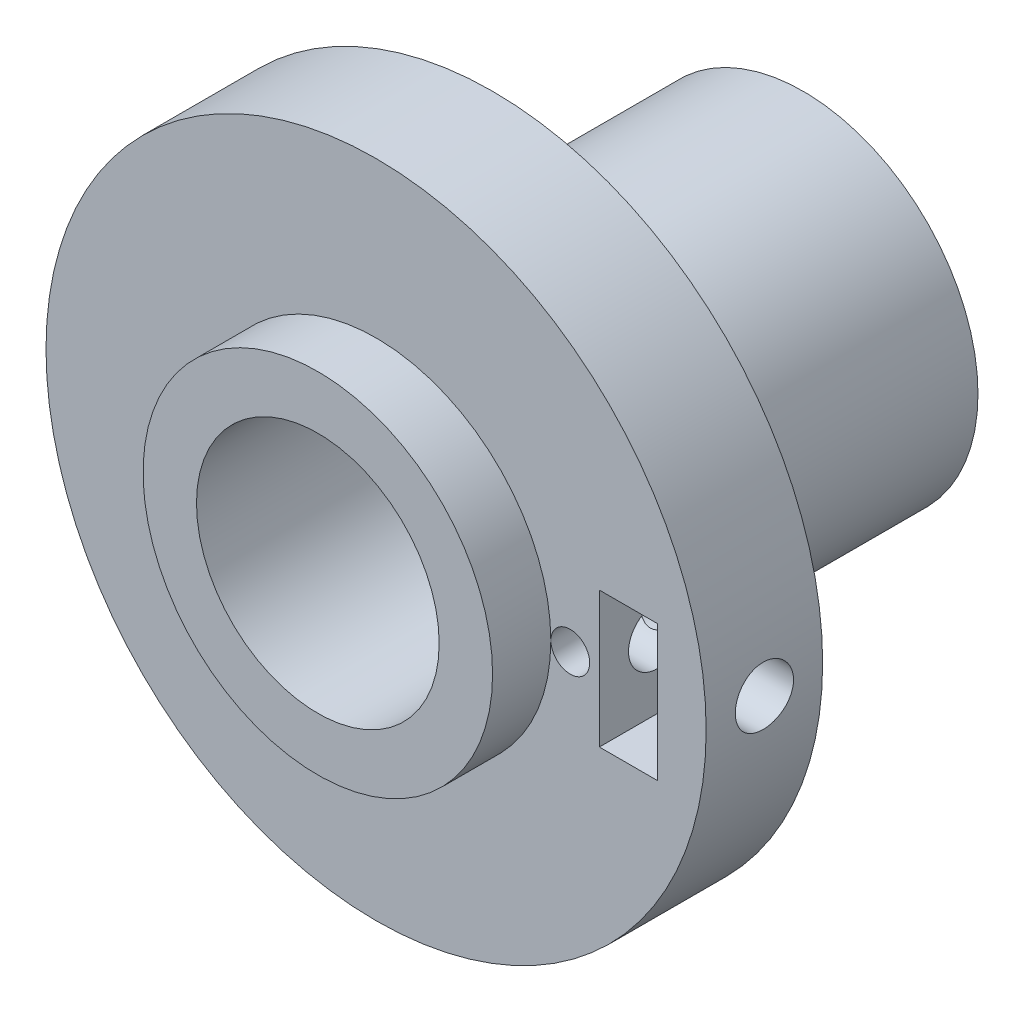
ISO-10303-21;
HEADER;
FILE_DESCRIPTION(('STEP AP214'),'2;1');
FILE_NAME('part.step','',(''),(''),'','','');
FILE_SCHEMA(('AUTOMOTIVE_DESIGN { 1 0 10303 214 1 1 1 1 }'));
ENDSEC;
DATA;
#1=APPLICATION_CONTEXT('core data for automotive mechanical design processes');
#2=APPLICATION_PROTOCOL_DEFINITION('international standard','automotive_design',2000,#1);
#3=PRODUCT_CONTEXT('',#1,'mechanical');
#4=PRODUCT('Part','Part','',(#3));
#5=PRODUCT_RELATED_PRODUCT_CATEGORY('part','',(#4));
#6=PRODUCT_DEFINITION_FORMATION('','',#4);
#7=PRODUCT_DEFINITION_CONTEXT('part definition',#1,'design');
#8=PRODUCT_DEFINITION('design','',#6,#7);
#9=PRODUCT_DEFINITION_SHAPE('','',#8);
#10=(LENGTH_UNIT() NAMED_UNIT(*) SI_UNIT(.MILLI.,.METRE.));
#11=(NAMED_UNIT(*) PLANE_ANGLE_UNIT() SI_UNIT($,.RADIAN.));
#12=(NAMED_UNIT(*) SI_UNIT($,.STERADIAN.) SOLID_ANGLE_UNIT());
#13=UNCERTAINTY_MEASURE_WITH_UNIT(LENGTH_MEASURE(1.E-05),#10,'distance_accuracy_value','');
#14=(GEOMETRIC_REPRESENTATION_CONTEXT(3) GLOBAL_UNCERTAINTY_ASSIGNED_CONTEXT((#13)) GLOBAL_UNIT_ASSIGNED_CONTEXT((#10,
#11,#12)) REPRESENTATION_CONTEXT('',''));
#15=CARTESIAN_POINT('',(0.,0.,0.));
#16=DIRECTION('',(0.,0.,1.));
#17=DIRECTION('',(1.,0.,0.));
#18=AXIS2_PLACEMENT_3D('',#15,#16,#17);
#19=CARTESIAN_POINT('',(9.,0.,11.));
#20=DIRECTION('',(1.,0.,0.));
#21=DIRECTION('',(0.,0.,-1.));
#22=AXIS2_PLACEMENT_3D('',#19,#20,#21);
#23=CYLINDRICAL_SURFACE('',#22,1.5);
#24=CARTESIAN_POINT('',(11.5,0.,11.));
#25=DIRECTION('',(-1.,0.,0.));
#26=DIRECTION('',(0.,-1.,0.));
#27=AXIS2_PLACEMENT_3D('',#24,#25,#26);
#28=CIRCLE('',#27,1.5);
#29=CARTESIAN_POINT('',(11.5,-1.5,11.));
#30=VERTEX_POINT('',#29);
#31=EDGE_CURVE('E37',#30,#30,#28,.F.);
#32=ORIENTED_EDGE('',*,*,#31,.T.);
#33=EDGE_LOOP('',(#32));
#34=FACE_BOUND('',#33,.T.);
#35=CARTESIAN_POINT('',(9.,0.,11.));
#36=DIRECTION('',(1.,0.,0.));
#37=DIRECTION('',(0.,0.,-1.));
#38=AXIS2_PLACEMENT_3D('',#35,#36,#37);
#39=CIRCLE('',#38,1.5);
#40=CARTESIAN_POINT('',(9.,0.,12.5));
#41=VERTEX_POINT('',#40);
#42=CARTESIAN_POINT('',(9.,0.,9.49999999999999));
#43=VERTEX_POINT('',#42);
#44=EDGE_CURVE('E132',#41,#43,#39,.T.);
#45=ORIENTED_EDGE('',*,*,#44,.F.);
#46=CARTESIAN_POINT('',(9.,0.,12.5));
#47=CARTESIAN_POINT('',(8.99999972518375,0.050242358334064,12.5000002082241));
#48=CARTESIAN_POINT('',(9.00380698497774,0.100484543566457,12.4974540137669));
#49=CARTESIAN_POINT('',(9.01879843205283,0.199366529015834,12.4875232621191));
#50=CARTESIAN_POINT('',(9.02998612156165,0.248005556977502,12.4801364079062));
#51=CARTESIAN_POINT('',(9.05905385866242,0.342106153927126,12.4612524120235));
#52=CARTESIAN_POINT('',(9.07690257000397,0.387581436328778,12.4497745274666));
#53=CARTESIAN_POINT('',(9.11853168163575,0.474707645498629,12.4236306893872));
#54=CARTESIAN_POINT('',(9.14231294315028,0.516358015804834,12.4089642730275));
#55=CARTESIAN_POINT('',(9.19732846868371,0.598642350385055,12.3761366468492));
#56=CARTESIAN_POINT('',(9.22902393037144,0.638890152730338,12.3577844878966));
#57=CARTESIAN_POINT('',(9.29786502432922,0.71386402234637,12.3199115654173));
#58=CARTESIAN_POINT('',(9.33501846491887,0.74858202771944,12.3003891517841));
#59=CARTESIAN_POINT('',(9.42052618380633,0.817111488727481,12.258641323394));
#60=CARTESIAN_POINT('',(9.46972282660172,0.849915931813757,12.236475339689));
#61=CARTESIAN_POINT('',(9.57418168882327,0.90675178507087,12.1954207367641));
#62=CARTESIAN_POINT('',(9.62943320078139,0.930798367132496,12.1765264797733));
#63=CARTESIAN_POINT('',(9.7283556467108,0.963370175057205,12.1498813332073));
#64=CARTESIAN_POINT('',(9.77076422643691,0.974372236180084,12.1404881394622));
#65=CARTESIAN_POINT('',(9.85737225237087,0.990753088926102,12.1262898482978));
#66=CARTESIAN_POINT('',(9.90156847436319,0.996141573259662,12.1214768437201));
#67=CARTESIAN_POINT('',(9.99073738942808,1.00095682070629,12.1171830280408));
#68=CARTESIAN_POINT('',(10.0357125117256,1.0003592145882,12.1177240127948));
#69=CARTESIAN_POINT('',(10.1248174867505,0.993187906666196,12.1240988774148));
#70=CARTESIAN_POINT('',(10.1689465910163,0.986609141899785,12.1299372414259));
#71=CARTESIAN_POINT('',(10.2532335256188,0.968324971088713,12.1456359299579));
#72=CARTESIAN_POINT('',(10.2934806679615,0.956858557405004,12.1553074416515));
#73=CARTESIAN_POINT('',(10.3715118454958,0.929350592909502,12.1775481146384));
#74=CARTESIAN_POINT('',(10.4092950651486,0.913307536614355,12.1901182291639));
#75=CARTESIAN_POINT('',(10.4895126976411,0.873369093698318,12.2198209820221));
#76=CARTESIAN_POINT('',(10.5313299500941,0.848540261643841,12.2373615892451));
#77=CARTESIAN_POINT('',(10.6106916974919,0.793344802336528,12.2734576892248));
#78=CARTESIAN_POINT('',(10.6482308288371,0.762971345040336,12.2920144137095));
#79=CARTESIAN_POINT('',(10.7262712728556,0.689905826559708,12.3327167186209));
#80=CARTESIAN_POINT('',(10.7656670243557,0.645969691404496,12.3547737235502));
#81=CARTESIAN_POINT('',(10.8365982472549,0.551003999553807,12.3960905033786));
#82=CARTESIAN_POINT('',(10.8681410727011,0.49998114967516,12.4153528882528));
#83=CARTESIAN_POINT('',(10.9167388593142,0.402428913545598,12.4457270204417));
#84=CARTESIAN_POINT('',(10.9354216816702,0.356978821685239,12.457696305825));
#85=CARTESIAN_POINT('',(10.9660524628119,0.263018021968452,12.4775385951552));
#86=CARTESIAN_POINT('',(10.9780061135659,0.214509939501015,12.4854150606384));
#87=CARTESIAN_POINT('',(10.9945805826192,0.115492726585944,12.4963794107833));
#88=CARTESIAN_POINT('',(10.9991697304692,0.0649759059670204,12.4994466123057));
#89=CARTESIAN_POINT('',(11.0006235442811,-0.03622075969462,12.5004155748259));
#90=CARTESIAN_POINT('',(10.9974887502444,-0.0869005930932851,12.4983176969281));
#91=CARTESIAN_POINT('',(10.984187972219,-0.18322785860215,12.4894979471214));
#92=CARTESIAN_POINT('',(10.9745313511223,-0.228978722339659,12.4831112319513));
#93=CARTESIAN_POINT('',(10.9492021569936,-0.318058196213643,12.466592246424));
#94=CARTESIAN_POINT('',(10.9335286245361,-0.361386418785358,12.4564593787341));
#95=CARTESIAN_POINT('',(10.8956738514773,-0.447332375233225,12.4324817626467));
#96=CARTESIAN_POINT('',(10.8731559229582,-0.489748092316567,12.4184493506824));
#97=CARTESIAN_POINT('',(10.8227833550277,-0.570341511977794,12.388009278054));
#98=CARTESIAN_POINT('',(10.794925419737,-0.608516574097259,12.3716001520065));
#99=CARTESIAN_POINT('',(10.7296960659176,-0.685927227415327,12.3347727332824));
#100=CARTESIAN_POINT('',(10.691516869948,-0.724375937862668,12.314130784062));
#101=CARTESIAN_POINT('',(10.6094442850359,-0.794669840332396,12.2728558653685));
#102=CARTESIAN_POINT('',(10.5655469805006,-0.826510468230437,12.2522229118595));
#103=CARTESIAN_POINT('',(10.4764287935708,-0.880623882794766,12.2146983950652));
#104=CARTESIAN_POINT('',(10.4316339831001,-0.903478180804396,12.1976379858866));
#105=CARTESIAN_POINT('',(10.3380636736094,-0.942481068876254,12.1671948720711));
#106=CARTESIAN_POINT('',(10.2892955308023,-0.958641728453861,12.1538055628277));
#107=CARTESIAN_POINT('',(10.197717756433,-0.981179217293121,12.1346660407653));
#108=CARTESIAN_POINT('',(10.1554140950705,-0.988792987823093,12.1279749900689));
#109=CARTESIAN_POINT('',(10.0697133593323,-0.998496029624889,12.1193973322293));
#110=CARTESIAN_POINT('',(10.0263175244268,-1.00059130142516,12.1175055067407));
#111=CARTESIAN_POINT('',(9.93967847164164,-0.999119609907758,12.1188210057483));
#112=CARTESIAN_POINT('',(9.89643535931854,-0.995549293852658,12.1220313495683));
#113=CARTESIAN_POINT('',(9.81132823572852,-0.982984986109972,12.1330522619864));
#114=CARTESIAN_POINT('',(9.76946614306961,-0.973983758587652,12.1408689675122));
#115=CARTESIAN_POINT('',(9.67714440678569,-0.94796517835631,12.1626342196827));
#116=CARTESIAN_POINT('',(9.62736614363047,-0.929450935941996,12.177661668546));
#117=CARTESIAN_POINT('',(9.53225658291059,-0.885422631474876,12.2111108062916));
#118=CARTESIAN_POINT('',(9.48693165103157,-0.859898741785423,12.2295372486188));
#119=CARTESIAN_POINT('',(9.40035905640316,-0.80199140269466,12.2680859326972));
#120=CARTESIAN_POINT('',(9.35920062728075,-0.769491549448274,12.2882329369107));
#121=CARTESIAN_POINT('',(9.28233876087877,-0.698358840177312,12.3281415077399));
#122=CARTESIAN_POINT('',(9.2466370014876,-0.659724105134954,12.3479029541764));
#123=CARTESIAN_POINT('',(9.17664394784294,-0.570728664877771,12.3881577598039));
#124=CARTESIAN_POINT('',(9.14329067991017,-0.519480834775989,12.4083490272456));
#125=CARTESIAN_POINT('',(9.08604336166801,-0.410434277887491,12.4438883293752));
#126=CARTESIAN_POINT('',(9.06213444658818,-0.352646031225024,12.4592439672273));
#127=CARTESIAN_POINT('',(9.02942271091798,-0.245717534917526,12.4805082241837));
#128=CARTESIAN_POINT('',(9.01844448045066,-0.197506162628868,12.4877574018445));
#129=CARTESIAN_POINT('',(9.00373598373098,-0.0995290060120657,12.4975014007095));
#130=CARTESIAN_POINT('',(9.000000272202,-0.0497644180940288,12.4999997937566));
#131=CARTESIAN_POINT('',(9.,0.,12.5));
#132=B_SPLINE_CURVE_WITH_KNOTS('',3,(#46,#47,#48,#49,#50,#51,#52,#53,#54,#55,#56,#57,#58,#59,
#60,#61,#62,#63,#64,#65,#66,#67,#68,#69,#70,#71,#72,#73,#74,#75,#76,#77,#78,#79,#80,#81,#82,#83,
#84,#85,#86,#87,#88,#89,#90,#91,#92,#93,#94,#95,#96,#97,#98,#99,#100,#101,#102,#103,#104,#105,
#106,#107,#108,#109,#110,#111,#112,#113,#114,#115,#116,#117,#118,#119,#120,#121,#122,#123,#124,
#125,#126,#127,#128,#129,#130,#131),.UNSPECIFIED.,.T.,.F.,(4,2,2,2,2,2,2,2,2,2,2,2,2,2,2,2,2,2,
2,2,2,2,2,2,2,2,2,2,2,2,2,2,2,2,2,2,2,2,2,2,2,2,4),(0.,0.1505266132527,0.301124707174344,
0.451023076595116,0.600943219336933,0.763585145002784,0.926462058021593,1.11503341647992,
1.3032765272272,1.43716846838015,1.57082883922905,1.7050335586769,1.83935198631677,
1.96774431099011,2.0961789190254,2.25073787329798,2.40548851889213,2.59359477247561,
2.78152420149866,2.93262043847564,3.08358867570591,3.2352044164631,3.38680955765892,
3.52776542395421,3.6687437756832,3.81826173413943,3.96787227471787,4.14114088069831,
4.31452876587064,4.47324967649701,4.63168313315307,4.76162024003012,4.89141600161491,
5.02128860137218,5.15133461921145,5.31603304346011,5.48096356682587,5.64889622595853,
5.81688041978686,6.00897675773025,6.20076953274024,6.34997645676983,6.49907115623395),.UNSPECIFIED.);
#133=EDGE_CURVE('E42',#41,#41,#132,.T.);
#134=ORIENTED_EDGE('',*,*,#133,.F.);
#135=EDGE_CURVE('E135',#43,#41,#39,.T.);
#136=ORIENTED_EDGE('',*,*,#135,.F.);
#137=CARTESIAN_POINT('',(9.,0.,9.49999999999999));
#138=CARTESIAN_POINT('',(8.99999972518375,-0.050242358334064,9.49999979177585));
#139=CARTESIAN_POINT('',(9.00380698497774,-0.100484543566457,9.50254598623307));
#140=CARTESIAN_POINT('',(9.01879843205283,-0.199366529015834,9.51247673788094));
#141=CARTESIAN_POINT('',(9.02998612156165,-0.248005556977502,9.51986359209382));
#142=CARTESIAN_POINT('',(9.05905385866242,-0.342106153927126,9.53874758797646));
#143=CARTESIAN_POINT('',(9.07690257000397,-0.387581436328778,9.55022547253342));
#144=CARTESIAN_POINT('',(9.11853168163575,-0.474707645498629,9.57636931061279));
#145=CARTESIAN_POINT('',(9.14231294315028,-0.516358015804834,9.59103572697245));
#146=CARTESIAN_POINT('',(9.19732846868371,-0.598642350385055,9.6238633531508));
#147=CARTESIAN_POINT('',(9.22902393037144,-0.638890152730338,9.6422155121034));
#148=CARTESIAN_POINT('',(9.29786502432922,-0.71386402234637,9.68008843458267));
#149=CARTESIAN_POINT('',(9.33501846491887,-0.74858202771944,9.69961084821584));
#150=CARTESIAN_POINT('',(9.42052618380633,-0.817111488727481,9.74135867660602));
#151=CARTESIAN_POINT('',(9.46972282660172,-0.849915931813757,9.763524660311));
#152=CARTESIAN_POINT('',(9.57418168882327,-0.90675178507087,9.80457926323592));
#153=CARTESIAN_POINT('',(9.62943320078139,-0.930798367132496,9.82347352022673));
#154=CARTESIAN_POINT('',(9.7283556467108,-0.963370175057205,9.85011866679264));
#155=CARTESIAN_POINT('',(9.77076422643691,-0.974372236180084,9.85951186053782));
#156=CARTESIAN_POINT('',(9.85737225237087,-0.990753088926102,9.87371015170214));
#157=CARTESIAN_POINT('',(9.90156847436319,-0.996141573259662,9.87852315627987));
#158=CARTESIAN_POINT('',(9.99073738942808,-1.00095682070629,9.88281697195916));
#159=CARTESIAN_POINT('',(10.0357125117256,-1.0003592145882,9.88227598720522));
#160=CARTESIAN_POINT('',(10.1248174867505,-0.993187906666196,9.87590112258514));
#161=CARTESIAN_POINT('',(10.1689465910163,-0.986609141899785,9.87006275857408));
#162=CARTESIAN_POINT('',(10.2532335256188,-0.968324971088713,9.85436407004209));
#163=CARTESIAN_POINT('',(10.2934806679615,-0.956858557405004,9.84469255834846));
#164=CARTESIAN_POINT('',(10.3715118454958,-0.929350592909502,9.82245188536155));
#165=CARTESIAN_POINT('',(10.4092950651486,-0.913307536614355,9.80988177083612));
#166=CARTESIAN_POINT('',(10.4895126976411,-0.873369093698318,9.78017901797788));
#167=CARTESIAN_POINT('',(10.5313299500941,-0.848540261643841,9.76263841075493));
#168=CARTESIAN_POINT('',(10.6106916974919,-0.793344802336527,9.72654231077516));
#169=CARTESIAN_POINT('',(10.6482308288371,-0.762971345040336,9.70798558629053));
#170=CARTESIAN_POINT('',(10.7262712728556,-0.689905826559708,9.66728328137904));
#171=CARTESIAN_POINT('',(10.7656670243557,-0.645969691404496,9.64522627644975));
#172=CARTESIAN_POINT('',(10.8365982472549,-0.551003999553807,9.60390949662143));
#173=CARTESIAN_POINT('',(10.8681410727011,-0.49998114967516,9.58464711174715));
#174=CARTESIAN_POINT('',(10.9167388593142,-0.402428913545598,9.55427297955834));
#175=CARTESIAN_POINT('',(10.9354216816702,-0.356978821685239,9.54230369417502));
#176=CARTESIAN_POINT('',(10.9660524628119,-0.263018021968452,9.52246140484478));
#177=CARTESIAN_POINT('',(10.9780061135659,-0.214509939501015,9.51458493936155));
#178=CARTESIAN_POINT('',(10.9945805826192,-0.115492726585944,9.50362058921668));
#179=CARTESIAN_POINT('',(10.9991697304692,-0.0649759059670204,9.50055338769424));
#180=CARTESIAN_POINT('',(11.0006235442811,0.0362207596946201,9.49958442517408));
#181=CARTESIAN_POINT('',(10.9974887502444,0.0869005930932851,9.50168230307184));
#182=CARTESIAN_POINT('',(10.984187972219,0.18322785860215,9.51050205287862));
#183=CARTESIAN_POINT('',(10.9745313511223,0.228978722339659,9.51688876804865));
#184=CARTESIAN_POINT('',(10.9492021569936,0.318058196213643,9.53340775357603));
#185=CARTESIAN_POINT('',(10.9335286245361,0.361386418785358,9.54354062126592));
#186=CARTESIAN_POINT('',(10.8956738514773,0.447332375233225,9.56751823735329));
#187=CARTESIAN_POINT('',(10.8731559229582,0.489748092316567,9.58155064931755));
#188=CARTESIAN_POINT('',(10.8227833550277,0.570341511977794,9.61199072194597));
#189=CARTESIAN_POINT('',(10.794925419737,0.608516574097259,9.62839984799348));
#190=CARTESIAN_POINT('',(10.7296960659176,0.685927227415327,9.66522726671757));
#191=CARTESIAN_POINT('',(10.691516869948,0.724375937862668,9.68586921593797));
#192=CARTESIAN_POINT('',(10.6094442850359,0.794669840332396,9.72714413463145));
#193=CARTESIAN_POINT('',(10.5655469805006,0.826510468230437,9.74777708814054));
#194=CARTESIAN_POINT('',(10.4764287935708,0.880623882794766,9.78530160493483));
#195=CARTESIAN_POINT('',(10.4316339831001,0.903478180804396,9.80236201411338));
#196=CARTESIAN_POINT('',(10.3380636736094,0.942481068876254,9.83280512792887));
#197=CARTESIAN_POINT('',(10.2892955308023,0.958641728453861,9.8461944371723));
#198=CARTESIAN_POINT('',(10.197717756433,0.981179217293121,9.86533395923468));
#199=CARTESIAN_POINT('',(10.1554140950705,0.988792987823093,9.87202500993105));
#200=CARTESIAN_POINT('',(10.0697133593323,0.998496029624889,9.88060266777071));
#201=CARTESIAN_POINT('',(10.0263175244268,1.00059130142516,9.88249449325934));
#202=CARTESIAN_POINT('',(9.93967847164164,0.999119609907758,9.88117899425167));
#203=CARTESIAN_POINT('',(9.89643535931854,0.995549293852658,9.87796865043166));
#204=CARTESIAN_POINT('',(9.81132823572852,0.982984986109972,9.8669477380136));
#205=CARTESIAN_POINT('',(9.76946614306961,0.973983758587652,9.85913103248783));
#206=CARTESIAN_POINT('',(9.67714440678569,0.94796517835631,9.8373657803173));
#207=CARTESIAN_POINT('',(9.62736614363047,0.929450935941996,9.82233833145398));
#208=CARTESIAN_POINT('',(9.53225658291059,0.885422631474876,9.78888919370839));
#209=CARTESIAN_POINT('',(9.48693165103157,0.859898741785423,9.77046275138117));
#210=CARTESIAN_POINT('',(9.40035905640316,0.80199140269466,9.73191406730274));
#211=CARTESIAN_POINT('',(9.35920062728075,0.769491549448274,9.71176706308929));
#212=CARTESIAN_POINT('',(9.28233876087877,0.698358840177312,9.67185849226007));
#213=CARTESIAN_POINT('',(9.2466370014876,0.659724105134954,9.6520970458236));
#214=CARTESIAN_POINT('',(9.17664394784294,0.570728664877771,9.61184224019608));
#215=CARTESIAN_POINT('',(9.14329067991017,0.519480834775989,9.59165097275442));
#216=CARTESIAN_POINT('',(9.08604336166801,0.410434277887491,9.55611167062482));
#217=CARTESIAN_POINT('',(9.06213444658818,0.352646031225024,9.54075603277269));
#218=CARTESIAN_POINT('',(9.02942271091798,0.245717534917526,9.51949177581632));
#219=CARTESIAN_POINT('',(9.01844448045066,0.197506162628868,9.51224259815554));
#220=CARTESIAN_POINT('',(9.00373598373098,0.0995290060120657,9.50249859929052));
#221=CARTESIAN_POINT('',(9.000000272202,0.0497644180940288,9.50000020624336));
#222=CARTESIAN_POINT('',(9.,0.,9.49999999999999));
#223=B_SPLINE_CURVE_WITH_KNOTS('',3,(#137,#138,#139,#140,#141,#142,#143,#144,#145,#146,#147,
#148,#149,#150,#151,#152,#153,#154,#155,#156,#157,#158,#159,#160,#161,#162,#163,#164,#165,#166,
#167,#168,#169,#170,#171,#172,#173,#174,#175,#176,#177,#178,#179,#180,#181,#182,#183,#184,#185,
#186,#187,#188,#189,#190,#191,#192,#193,#194,#195,#196,#197,#198,#199,#200,#201,#202,#203,#204,
#205,#206,#207,#208,#209,#210,#211,#212,#213,#214,#215,#216,#217,#218,#219,#220,#221,#222),
.UNSPECIFIED.,.T.,.F.,(4,2,2,2,2,2,2,2,2,2,2,2,2,2,2,2,2,2,2,2,2,2,2,2,2,2,2,2,2,2,2,2,2,2,2,2,
2,2,2,2,2,2,4),(0.,0.1505266132527,0.301124707174344,0.451023076595116,0.600943219336933,
0.763585145002784,0.926462058021593,1.11503341647992,1.3032765272272,1.43716846838015,
1.57082883922905,1.7050335586769,1.83935198631677,1.96774431099011,2.0961789190254,
2.25073787329798,2.40548851889213,2.59359477247561,2.78152420149866,2.93262043847564,
3.08358867570591,3.2352044164631,3.38680955765892,3.52776542395421,3.6687437756832,
3.81826173413943,3.96787227471787,4.14114088069831,4.31452876587064,4.47324967649701,
4.63168313315307,4.76162024003012,4.89141600161491,5.02128860137218,5.15133461921145,
5.31603304346011,5.48096356682587,5.64889622595853,5.81688041978686,6.00897675773025,
6.20076953274024,6.34997645676983,6.49907115623395),.UNSPECIFIED.);
#224=EDGE_CURVE('E11',#43,#43,#223,.T.);
#225=ORIENTED_EDGE('',*,*,#224,.F.);
#226=EDGE_LOOP('',(#45,#134,#136,#225));
#227=FACE_BOUND('',#226,.T.);
#228=ADVANCED_FACE('F33',(#34,#227),#23,.F.);
#229=CARTESIAN_POINT('',(10.,0.,14.));
#230=DIRECTION('',(0.,0.,-1.));
#231=DIRECTION('',(-1.,0.,0.));
#232=AXIS2_PLACEMENT_3D('',#229,#230,#231);
#233=CYLINDRICAL_SURFACE('',#232,1.);
#234=ORIENTED_EDGE('',*,*,#224,.T.);
#235=EDGE_LOOP('',(#234));
#236=FACE_BOUND('',#235,.T.);
#237=CARTESIAN_POINT('',(10.,0.,8.));
#238=DIRECTION('',(0.,0.,-1.));
#239=DIRECTION('',(-1.,0.,0.));
#240=AXIS2_PLACEMENT_3D('',#237,#238,#239);
#241=CIRCLE('',#240,1.);
#242=CARTESIAN_POINT('',(9.,0.,8.));
#243=VERTEX_POINT('',#242);
#244=EDGE_CURVE('E145',#243,#243,#241,.T.);
#245=ORIENTED_EDGE('',*,*,#244,.T.);
#246=EDGE_LOOP('',(#245));
#247=FACE_BOUND('',#246,.T.);
#248=ADVANCED_FACE('F190',(#236,#247),#233,.F.);
#249=CARTESIAN_POINT('',(0.,0.,-8.));
#250=DIRECTION('',(0.,0.,1.));
#251=DIRECTION('',(1.,0.,0.));
#252=AXIS2_PLACEMENT_3D('',#249,#250,#251);
#253=PLANE('',#252);
#254=CARTESIAN_POINT('',(0.,0.,-8.));
#255=DIRECTION('',(0.,0.,1.));
#256=DIRECTION('',(1.,0.,0.));
#257=AXIS2_PLACEMENT_3D('',#254,#255,#256);
#258=CIRCLE('',#257,9.);
#259=CARTESIAN_POINT('',(9.,0.,-8.));
#260=VERTEX_POINT('',#259);
#261=EDGE_CURVE('E331',#260,#260,#258,.T.);
#262=ORIENTED_EDGE('',*,*,#261,.F.);
#263=EDGE_LOOP('',(#262));
#264=FACE_BOUND('',#263,.T.);
#265=CARTESIAN_POINT('',(0.,0.,-8.));
#266=DIRECTION('',(0.,0.,1.));
#267=DIRECTION('',(1.,0.,0.));
#268=AXIS2_PLACEMENT_3D('',#265,#266,#267);
#269=CIRCLE('',#268,6.25);
#270=CARTESIAN_POINT('',(6.25,0.,-8.));
#271=VERTEX_POINT('',#270);
#272=EDGE_CURVE('E334',#271,#271,#269,.T.);
#273=ORIENTED_EDGE('',*,*,#272,.T.);
#274=EDGE_LOOP('',(#273));
#275=FACE_BOUND('',#274,.T.);
#276=ADVANCED_FACE('F195',(#264,#275),#253,.F.);
#277=CARTESIAN_POINT('',(0.,0.,8.));
#278=DIRECTION('',(0.,0.,-1.));
#279=DIRECTION('',(-1.,0.,0.));
#280=AXIS2_PLACEMENT_3D('',#277,#278,#279);
#281=CYLINDRICAL_SURFACE('',#280,9.);
#282=CARTESIAN_POINT('',(0.,0.,8.));
#283=DIRECTION('',(0.,0.,1.));
#284=DIRECTION('',(1.,0.,0.));
#285=AXIS2_PLACEMENT_3D('',#282,#283,#284);
#286=CIRCLE('',#285,9.);
#287=EDGE_CURVE('E337',#243,#243,#286,.T.);
#288=ORIENTED_EDGE('',*,*,#287,.F.);
#289=EDGE_LOOP('',(#288));
#290=FACE_BOUND('',#289,.T.);
#291=ORIENTED_EDGE('',*,*,#261,.T.);
#292=EDGE_LOOP('',(#291));
#293=FACE_BOUND('',#292,.T.);
#294=ADVANCED_FACE('F35',(#290,#293),#281,.T.);
#295=CARTESIAN_POINT('',(0.,0.,8.));
#296=DIRECTION('',(0.,0.,-1.));
#297=DIRECTION('',(-1.,0.,0.));
#298=AXIS2_PLACEMENT_3D('',#295,#296,#297);
#299=CYLINDRICAL_SURFACE('',#298,6.25);
#300=ORIENTED_EDGE('',*,*,#272,.F.);
#301=EDGE_LOOP('',(#300));
#302=FACE_BOUND('',#301,.T.);
#303=CARTESIAN_POINT('',(0.,0.,17.));
#304=DIRECTION('',(0.,0.,1.));
#305=DIRECTION('',(1.,0.,0.));
#306=AXIS2_PLACEMENT_3D('',#303,#304,#305);
#307=CIRCLE('',#306,6.25);
#308=CARTESIAN_POINT('',(6.25,0.,17.));
#309=VERTEX_POINT('',#308);
#310=EDGE_CURVE('E125',#309,#309,#307,.T.);
#311=ORIENTED_EDGE('',*,*,#310,.T.);
#312=EDGE_LOOP('',(#311));
#313=FACE_BOUND('',#312,.T.);
#314=ADVANCED_FACE('F263',(#302,#313),#299,.F.);
#315=CARTESIAN_POINT('',(0.,0.,14.));
#316=DIRECTION('',(0.,0.,1.));
#317=DIRECTION('',(1.,0.,0.));
#318=AXIS2_PLACEMENT_3D('',#315,#316,#317);
#319=PLANE('',#318);
#320=DIRECTION('',(0.,-1.,0.));
#321=VECTOR('',#320,1.);
#322=CARTESIAN_POINT('',(11.5,0.,14.));
#323=LINE('',#322,#321);
#324=CARTESIAN_POINT('',(11.5,3.5,14.));
#325=VERTEX_POINT('',#324);
#326=CARTESIAN_POINT('',(11.5,-3.5,14.));
#327=VERTEX_POINT('',#326);
#328=EDGE_CURVE('E119',#325,#327,#323,.T.);
#329=ORIENTED_EDGE('',*,*,#328,.F.);
#330=DIRECTION('',(-1.,0.,0.));
#331=VECTOR('',#330,1.);
#332=CARTESIAN_POINT('',(0.,3.5,14.));
#333=LINE('',#332,#331);
#334=CARTESIAN_POINT('',(14.5,3.5,14.));
#335=VERTEX_POINT('',#334);
#336=EDGE_CURVE('E121',#335,#325,#333,.T.);
#337=ORIENTED_EDGE('',*,*,#336,.F.);
#338=DIRECTION('',(0.,1.,0.));
#339=VECTOR('',#338,1.);
#340=CARTESIAN_POINT('',(14.5,0.,14.));
#341=LINE('',#340,#339);
#342=CARTESIAN_POINT('',(14.5,-3.5,14.));
#343=VERTEX_POINT('',#342);
#344=EDGE_CURVE('E95',#343,#335,#341,.T.);
#345=ORIENTED_EDGE('',*,*,#344,.F.);
#346=DIRECTION('',(1.,0.,0.));
#347=VECTOR('',#346,1.);
#348=CARTESIAN_POINT('',(0.,-3.5,14.));
#349=LINE('',#348,#347);
#350=EDGE_CURVE('E123',#327,#343,#349,.T.);
#351=ORIENTED_EDGE('',*,*,#350,.F.);
#352=EDGE_LOOP('',(#329,#337,#345,#351));
#353=FACE_BOUND('',#352,.T.);
#354=CARTESIAN_POINT('',(10.,0.,14.));
#355=DIRECTION('',(0.,0.,-1.));
#356=DIRECTION('',(-1.,0.,0.));
#357=AXIS2_PLACEMENT_3D('',#354,#355,#356);
#358=CIRCLE('',#357,1.);
#359=CARTESIAN_POINT('',(9.,0.,14.));
#360=VERTEX_POINT('',#359);
#361=EDGE_CURVE('E146',#360,#360,#358,.T.);
#362=ORIENTED_EDGE('',*,*,#361,.T.);
#363=CARTESIAN_POINT('',(0.,0.,14.));
#364=DIRECTION('',(0.,0.,1.));
#365=DIRECTION('',(1.,0.,0.));
#366=AXIS2_PLACEMENT_3D('',#363,#364,#365);
#367=CIRCLE('',#366,9.);
#368=EDGE_CURVE('E128',#360,#360,#367,.T.);
#369=ORIENTED_EDGE('',*,*,#368,.F.);
#370=EDGE_LOOP('',(#362,#369));
#371=FACE_BOUND('',#370,.T.);
#372=CARTESIAN_POINT('',(0.,0.,14.));
#373=DIRECTION('',(0.,0.,1.));
#374=DIRECTION('',(1.,0.,0.));
#375=AXIS2_PLACEMENT_3D('',#372,#373,#374);
#376=CIRCLE('',#375,17.);
#377=CARTESIAN_POINT('',(17.,0.,14.));
#378=VERTEX_POINT('',#377);
#379=EDGE_CURVE('E335',#378,#378,#376,.T.);
#380=ORIENTED_EDGE('',*,*,#379,.T.);
#381=EDGE_LOOP('',(#380));
#382=FACE_BOUND('',#381,.T.);
#383=ADVANCED_FACE('F254',(#353,#371,#382),#319,.T.);
#384=CARTESIAN_POINT('',(0.,0.,8.));
#385=DIRECTION('',(0.,0.,1.));
#386=DIRECTION('',(1.,0.,0.));
#387=AXIS2_PLACEMENT_3D('',#384,#385,#386);
#388=PLANE('',#387);
#389=DIRECTION('',(1.,0.,0.));
#390=VECTOR('',#389,1.);
#391=CARTESIAN_POINT('',(14.5,3.5,8.));
#392=LINE('',#391,#390);
#393=CARTESIAN_POINT('',(11.5,3.5,8.));
#394=VERTEX_POINT('',#393);
#395=CARTESIAN_POINT('',(14.5,3.5,8.));
#396=VERTEX_POINT('',#395);
#397=EDGE_CURVE('E101',#394,#396,#392,.T.);
#398=ORIENTED_EDGE('',*,*,#397,.F.);
#399=DIRECTION('',(0.,1.,0.));
#400=VECTOR('',#399,1.);
#401=CARTESIAN_POINT('',(11.5,3.5,8.));
#402=LINE('',#401,#400);
#403=CARTESIAN_POINT('',(11.5,-3.5,8.));
#404=VERTEX_POINT('',#403);
#405=EDGE_CURVE('E58',#404,#394,#402,.T.);
#406=ORIENTED_EDGE('',*,*,#405,.F.);
#407=DIRECTION('',(-1.,0.,0.));
#408=VECTOR('',#407,1.);
#409=CARTESIAN_POINT('',(14.5,-3.5,8.));
#410=LINE('',#409,#408);
#411=CARTESIAN_POINT('',(14.5,-3.5,8.));
#412=VERTEX_POINT('',#411);
#413=EDGE_CURVE('E108',#412,#404,#410,.T.);
#414=ORIENTED_EDGE('',*,*,#413,.F.);
#415=DIRECTION('',(0.,-1.,0.));
#416=VECTOR('',#415,1.);
#417=CARTESIAN_POINT('',(14.5,3.5,8.));
#418=LINE('',#417,#416);
#419=EDGE_CURVE('E92',#396,#412,#418,.T.);
#420=ORIENTED_EDGE('',*,*,#419,.F.);
#421=EDGE_LOOP('',(#398,#406,#414,#420));
#422=FACE_BOUND('',#421,.T.);
#423=ORIENTED_EDGE('',*,*,#287,.T.);
#424=ORIENTED_EDGE('',*,*,#244,.F.);
#425=EDGE_LOOP('',(#423,#424));
#426=FACE_BOUND('',#425,.T.);
#427=CARTESIAN_POINT('',(0.,0.,8.));
#428=DIRECTION('',(0.,0.,1.));
#429=DIRECTION('',(1.,0.,0.));
#430=AXIS2_PLACEMENT_3D('',#427,#428,#429);
#431=CIRCLE('',#430,17.);
#432=CARTESIAN_POINT('',(17.,0.,8.));
#433=VERTEX_POINT('',#432);
#434=EDGE_CURVE('E339',#433,#433,#431,.T.);
#435=ORIENTED_EDGE('',*,*,#434,.F.);
#436=EDGE_LOOP('',(#435));
#437=FACE_BOUND('',#436,.T.);
#438=ADVANCED_FACE('F105',(#422,#426,#437),#388,.F.);
#439=CARTESIAN_POINT('',(0.,0.,14.));
#440=DIRECTION('',(0.,0.,-1.));
#441=DIRECTION('',(-1.,0.,0.));
#442=AXIS2_PLACEMENT_3D('',#439,#440,#441);
#443=CYLINDRICAL_SURFACE('',#442,17.);
#444=CARTESIAN_POINT('',(17.,0.,9.49999999999999));
#445=CARTESIAN_POINT('',(16.9999991366692,-0.0840802358664999,9.50000366418635));
#446=CARTESIAN_POINT('',(16.9993695779826,-0.168217256556168,9.50709327184917));
#447=CARTESIAN_POINT('',(16.9969186756702,-0.334162101229269,9.53527000156089));
#448=CARTESIAN_POINT('',(16.9950959921048,-0.41596719842642,9.55637286158571));
#449=CARTESIAN_POINT('',(16.9904647505681,-0.574820875222161,9.61195996186659));
#450=CARTESIAN_POINT('',(16.987656760896,-0.651872166635592,9.64643648974168));
#451=CARTESIAN_POINT('',(16.9813695548534,-0.799076197986141,9.72777813385307));
#452=CARTESIAN_POINT('',(16.9778904793125,-0.869230380650741,9.77464065160848));
#453=CARTESIAN_POINT('',(16.9706402702899,-1.00086587600031,9.87956736409581));
#454=CARTESIAN_POINT('',(16.9668684232275,-1.06232489780315,9.93765947699701));
#455=CARTESIAN_POINT('',(16.9594637448475,-1.17463411612825,10.0633371788286));
#456=CARTESIAN_POINT('',(16.9558309197295,-1.22548383998342,10.1309231905083));
#457=CARTESIAN_POINT('',(16.9491080590586,-1.31520757683625,10.273806568237));
#458=CARTESIAN_POINT('',(16.946018923213,-1.35406181812048,10.3491163959094));
#459=CARTESIAN_POINT('',(16.9407415951097,-1.4185653804641,10.5052229136232));
#460=CARTESIAN_POINT('',(16.9385533852002,-1.44421496024305,10.5860194961272));
#461=CARTESIAN_POINT('',(16.9353318119117,-1.48151599727451,10.7505813680852));
#462=CARTESIAN_POINT('',(16.9342954355067,-1.49320398201809,10.8343383179384));
#463=CARTESIAN_POINT('',(16.9334854039232,-1.50236291350133,11.0026310883707));
#464=CARTESIAN_POINT('',(16.9337117224385,-1.49983415642455,11.0871668926869));
#465=CARTESIAN_POINT('',(16.9353987670437,-1.48066155151999,11.2543669850478));
#466=CARTESIAN_POINT('',(16.9368560169532,-1.46405745233263,11.3370358709987));
#467=CARTESIAN_POINT('',(16.9408352833957,-1.41726727227211,11.4984088198015));
#468=CARTESIAN_POINT('',(16.9433573114304,-1.38708104468567,11.577112839815));
#469=CARTESIAN_POINT('',(16.949185966917,-1.31393915314471,11.7284483058373));
#470=CARTESIAN_POINT('',(16.9524936854572,-1.27096571042549,11.8010711154691));
#471=CARTESIAN_POINT('',(16.9595200433788,-1.17348205158942,11.9380882040862));
#472=CARTESIAN_POINT('',(16.9632386921032,-1.11897157314285,12.0024822959132));
#473=CARTESIAN_POINT('',(16.9706833852774,-0.999738513125816,12.1214451161986));
#474=CARTESIAN_POINT('',(16.9744094114053,-0.934981578037631,12.1759794201801));
#475=CARTESIAN_POINT('',(16.9814369213681,-0.797213511535076,12.2734082934455));
#476=CARTESIAN_POINT('',(16.984738404872,-0.724202373686209,12.3163028536556));
#477=CARTESIAN_POINT('',(16.9905455904275,-0.571975637683147,12.3892326872116));
#478=CARTESIAN_POINT('',(16.9930511943361,-0.49275927583995,12.4192663747941));
#479=CARTESIAN_POINT('',(16.996983221751,-0.330381291940772,12.4655975051301));
#480=CARTESIAN_POINT('',(16.9984096703698,-0.247219761738222,12.4818952675246));
#481=CARTESIAN_POINT('',(17.0000194423459,-0.079610403023099,12.500248612755));
#482=CARTESIAN_POINT('',(17.0002069148657,0.00483218206200319,12.5023517320239));
#483=CARTESIAN_POINT('',(16.9993287054252,0.172868703136019,12.4923807093475));
#484=CARTESIAN_POINT('',(16.9982630365922,0.256462648005646,12.4803067159151));
#485=CARTESIAN_POINT('',(16.9950010291973,0.420292963294034,12.4423636144201));
#486=CARTESIAN_POINT('',(16.9928065018153,0.500534490142744,12.4165166018904));
#487=CARTESIAN_POINT('',(16.9875332102989,0.655542086495678,12.3517837699911));
#488=CARTESIAN_POINT('',(16.9844544305543,0.73030805930762,12.312897720434));
#489=CARTESIAN_POINT('',(16.9777472136144,0.87245816037381,12.2230716196486));
#490=CARTESIAN_POINT('',(16.9741173526791,0.939822365439242,12.172100147881));
#491=CARTESIAN_POINT('',(16.9667203650642,1.06505544188414,12.059595390877));
#492=CARTESIAN_POINT('',(16.9629532357112,1.12292412819998,11.9980618998392));
#493=CARTESIAN_POINT('',(16.9556939504594,1.22768709603156,11.8659732195216));
#494=CARTESIAN_POINT('',(16.9522025910796,1.27455030776123,11.7953933381174));
#495=CARTESIAN_POINT('',(16.9459016871797,1.35575886575025,11.64733797843));
#496=CARTESIAN_POINT('',(16.9430921351492,1.39010434989805,11.5698625761158));
#497=CARTESIAN_POINT('',(16.9384775839307,1.44524983562932,11.4103244758928));
#498=CARTESIAN_POINT('',(16.9366711856513,1.46606870960856,11.32826834349));
#499=CARTESIAN_POINT('',(16.9342628924147,1.49363139208434,11.1618084954386));
#500=CARTESIAN_POINT('',(16.9336609712026,1.5003755073806,11.0774048310016));
#501=CARTESIAN_POINT('',(16.9337302183425,1.49959349529965,10.9089546040002));
#502=CARTESIAN_POINT('',(16.934397031893,1.49211618154856,10.8249078087364));
#503=CARTESIAN_POINT('',(16.936919354309,1.46320550589637,10.659268845807));
#504=CARTESIAN_POINT('',(16.9387748648697,1.44177212409336,10.5776766816421));
#505=CARTESIAN_POINT('',(16.9434643498395,1.38557040876227,10.4192609065865));
#506=CARTESIAN_POINT('',(16.9462982480851,1.35080311320261,10.3424369250608));
#507=CARTESIAN_POINT('',(16.9526253396978,1.26892580427019,10.1957079525162));
#508=CARTESIAN_POINT('',(16.9561185245598,1.22181595011684,10.1258028722592));
#509=CARTESIAN_POINT('',(16.9633848931066,1.11640728077523,9.99464606425309));
#510=CARTESIAN_POINT('',(16.9671589585558,1.05807223244496,9.93342350521638));
#511=CARTESIAN_POINT('',(16.9745537766173,0.931936963261482,9.82161248595841));
#512=CARTESIAN_POINT('',(16.97817449202,0.864134462128932,9.7710265950046));
#513=CARTESIAN_POINT('',(16.9848619761362,0.720843098972519,9.68184832527082));
#514=CARTESIAN_POINT('',(16.9879276001517,0.645338844429665,9.64328061473432));
#515=CARTESIAN_POINT('',(16.9931463894423,0.488949731353306,9.57942043598087));
#516=CARTESIAN_POINT('',(16.9953005975204,0.408071145215389,9.55411278821875));
#517=CARTESIAN_POINT('',(16.9979040364892,0.272267186189502,9.52389947417437));
#518=CARTESIAN_POINT('',(16.9986864208092,0.218213808395124,9.514949174736));
#519=CARTESIAN_POINT('',(16.9997346827935,0.109448307539668,9.50299825400014));
#520=CARTESIAN_POINT('',(17.0000005620279,0.0547361864815619,9.49999761461673));
#521=CARTESIAN_POINT('',(17.,0.,9.49999999999999));
#522=B_SPLINE_CURVE_WITH_KNOTS('',3,(#444,#445,#446,#447,#448,#449,#450,#451,#452,#453,#454,
#455,#456,#457,#458,#459,#460,#461,#462,#463,#464,#465,#466,#467,#468,#469,#470,#471,#472,#473,
#474,#475,#476,#477,#478,#479,#480,#481,#482,#483,#484,#485,#486,#487,#488,#489,#490,#491,#492,
#493,#494,#495,#496,#497,#498,#499,#500,#501,#502,#503,#504,#505,#506,#507,#508,#509,#510,#511,
#512,#513,#514,#515,#516,#517,#518,#519,#520,#521),.UNSPECIFIED.,.T.,.F.,(4,2,2,2,2,2,2,2,2,2,2,
2,2,2,2,2,2,2,2,2,2,2,2,2,2,2,2,2,2,2,2,2,2,2,2,2,2,2,4),(0.,0.252040852757286,
0.504365246877548,0.756544345352494,1.00867058061988,1.26143188749012,1.51420445301807,
1.76739145693377,2.02057349995601,2.27309168593404,2.52560461111023,2.77740680852379,
3.02921172595373,3.28136839051262,3.53353078923871,3.78655726723962,4.03958394248664,
4.29264180729389,4.54569378316716,4.79789789108671,5.05009935705509,5.30189743849975,
5.55369996535093,5.80616446692185,6.05863388833423,6.31180771599295,6.56497875474309,
6.81779580511231,7.07060734455153,7.32255269951577,7.57449841376497,7.82642451947048,
8.07834737548102,8.33109746875405,8.58390854338801,8.83723516529165,9.09027115274211,
9.25435010556811,9.41842855962239),.UNSPECIFIED.);
#523=CARTESIAN_POINT('',(17.,0.,9.49999999999999));
#524=VERTEX_POINT('',#523);
#525=EDGE_CURVE('E137',#524,#524,#522,.T.);
#526=ORIENTED_EDGE('',*,*,#525,.T.);
#527=EDGE_LOOP('',(#526));
#528=FACE_BOUND('',#527,.T.);
#529=ORIENTED_EDGE('',*,*,#379,.F.);
#530=EDGE_LOOP('',(#529));
#531=FACE_BOUND('',#530,.T.);
#532=ORIENTED_EDGE('',*,*,#434,.T.);
#533=EDGE_LOOP('',(#532));
#534=FACE_BOUND('',#533,.T.);
#535=ADVANCED_FACE('F148',(#528,#531,#534),#443,.T.);
#536=ORIENTED_EDGE('',*,*,#133,.T.);
#537=EDGE_LOOP('',(#536));
#538=FACE_BOUND('',#537,.T.);
#539=ORIENTED_EDGE('',*,*,#361,.F.);
#540=EDGE_LOOP('',(#539));
#541=FACE_BOUND('',#540,.T.);
#542=ADVANCED_FACE('F158',(#538,#541),#233,.F.);
#543=CARTESIAN_POINT('',(14.5,0.,11.));
#544=DIRECTION('',(1.,0.,0.));
#545=DIRECTION('',(0.,1.,0.));
#546=AXIS2_PLACEMENT_3D('',#543,#544,#545);
#547=CIRCLE('',#546,1.5);
#548=CARTESIAN_POINT('',(14.5,1.5,11.));
#549=VERTEX_POINT('',#548);
#550=EDGE_CURVE('E115',#549,#549,#547,.F.);
#551=ORIENTED_EDGE('',*,*,#550,.T.);
#552=EDGE_LOOP('',(#551));
#553=FACE_BOUND('',#552,.T.);
#554=ORIENTED_EDGE('',*,*,#525,.F.);
#555=EDGE_LOOP('',(#554));
#556=FACE_BOUND('',#555,.T.);
#557=ADVANCED_FACE('F152',(#553,#556),#23,.F.);
#558=CARTESIAN_POINT('',(9.,0.,11.));
#559=DIRECTION('',(1.,0.,0.));
#560=DIRECTION('',(0.,0.,-1.));
#561=AXIS2_PLACEMENT_3D('',#558,#559,#560);
#562=PLANE('',#561);
#563=ORIENTED_EDGE('',*,*,#44,.T.);
#564=ORIENTED_EDGE('',*,*,#135,.T.);
#565=EDGE_LOOP('',(#563,#564));
#566=FACE_BOUND('',#565,.T.);
#567=ADVANCED_FACE('F157',(#566),#562,.T.);
#568=CARTESIAN_POINT('',(0.,0.,17.));
#569=DIRECTION('',(0.,0.,1.));
#570=DIRECTION('',(1.,0.,0.));
#571=AXIS2_PLACEMENT_3D('',#568,#569,#570);
#572=PLANE('',#571);
#573=CARTESIAN_POINT('',(0.,0.,17.));
#574=DIRECTION('',(0.,0.,1.));
#575=DIRECTION('',(1.,0.,0.));
#576=AXIS2_PLACEMENT_3D('',#573,#574,#575);
#577=CIRCLE('',#576,9.);
#578=CARTESIAN_POINT('',(9.,0.,17.));
#579=VERTEX_POINT('',#578);
#580=EDGE_CURVE('E129',#579,#579,#577,.T.);
#581=ORIENTED_EDGE('',*,*,#580,.T.);
#582=EDGE_LOOP('',(#581));
#583=FACE_BOUND('',#582,.T.);
#584=ORIENTED_EDGE('',*,*,#310,.F.);
#585=EDGE_LOOP('',(#584));
#586=FACE_BOUND('',#585,.T.);
#587=ADVANCED_FACE('F207',(#583,#586),#572,.T.);
#588=CARTESIAN_POINT('',(0.,0.,17.));
#589=DIRECTION('',(0.,0.,-1.));
#590=DIRECTION('',(-1.,0.,0.));
#591=AXIS2_PLACEMENT_3D('',#588,#589,#590);
#592=CYLINDRICAL_SURFACE('',#591,9.);
#593=ORIENTED_EDGE('',*,*,#580,.F.);
#594=EDGE_LOOP('',(#593));
#595=FACE_BOUND('',#594,.T.);
#596=ORIENTED_EDGE('',*,*,#368,.T.);
#597=EDGE_LOOP('',(#596));
#598=FACE_BOUND('',#597,.T.);
#599=ADVANCED_FACE('F186',(#595,#598),#592,.T.);
#600=CARTESIAN_POINT('',(11.5,3.5,18.));
#601=DIRECTION('',(-1.,0.,0.));
#602=DIRECTION('',(0.,-1.,0.));
#603=AXIS2_PLACEMENT_3D('',#600,#601,#602);
#604=PLANE('',#603);
#605=ORIENTED_EDGE('',*,*,#328,.T.);
#606=DIRECTION('',(0.,0.,-1.));
#607=VECTOR('',#606,1.);
#608=CARTESIAN_POINT('',(11.5,-3.5,18.));
#609=LINE('',#608,#607);
#610=EDGE_CURVE('E113',#327,#404,#609,.T.);
#611=ORIENTED_EDGE('',*,*,#610,.T.);
#612=ORIENTED_EDGE('',*,*,#405,.T.);
#613=DIRECTION('',(0.,0.,-1.));
#614=VECTOR('',#613,1.);
#615=CARTESIAN_POINT('',(11.5,3.5,18.));
#616=LINE('',#615,#614);
#617=EDGE_CURVE('E98',#325,#394,#616,.T.);
#618=ORIENTED_EDGE('',*,*,#617,.F.);
#619=EDGE_LOOP('',(#605,#611,#612,#618));
#620=FACE_BOUND('',#619,.T.);
#621=ORIENTED_EDGE('',*,*,#31,.F.);
#622=EDGE_LOOP('',(#621));
#623=FACE_BOUND('',#622,.T.);
#624=ADVANCED_FACE('F178',(#620,#623),#604,.F.);
#625=CARTESIAN_POINT('',(14.5,3.5,18.));
#626=DIRECTION('',(1.,0.,0.));
#627=DIRECTION('',(0.,1.,0.));
#628=AXIS2_PLACEMENT_3D('',#625,#626,#627);
#629=PLANE('',#628);
#630=ORIENTED_EDGE('',*,*,#344,.T.);
#631=DIRECTION('',(0.,0.,-1.));
#632=VECTOR('',#631,1.);
#633=CARTESIAN_POINT('',(14.5,3.5,18.));
#634=LINE('',#633,#632);
#635=EDGE_CURVE('E50',#335,#396,#634,.T.);
#636=ORIENTED_EDGE('',*,*,#635,.T.);
#637=ORIENTED_EDGE('',*,*,#419,.T.);
#638=DIRECTION('',(0.,0.,-1.));
#639=VECTOR('',#638,1.);
#640=CARTESIAN_POINT('',(14.5,-3.5,18.));
#641=LINE('',#640,#639);
#642=EDGE_CURVE('E97',#343,#412,#641,.T.);
#643=ORIENTED_EDGE('',*,*,#642,.F.);
#644=EDGE_LOOP('',(#630,#636,#637,#643));
#645=FACE_BOUND('',#644,.T.);
#646=ORIENTED_EDGE('',*,*,#550,.F.);
#647=EDGE_LOOP('',(#646));
#648=FACE_BOUND('',#647,.T.);
#649=ADVANCED_FACE('F88',(#645,#648),#629,.F.);
#650=CARTESIAN_POINT('',(14.5,-3.5,18.));
#651=DIRECTION('',(0.,-1.,0.));
#652=DIRECTION('',(1.,0.,0.));
#653=AXIS2_PLACEMENT_3D('',#650,#651,#652);
#654=PLANE('',#653);
#655=ORIENTED_EDGE('',*,*,#350,.T.);
#656=ORIENTED_EDGE('',*,*,#642,.T.);
#657=ORIENTED_EDGE('',*,*,#413,.T.);
#658=ORIENTED_EDGE('',*,*,#610,.F.);
#659=EDGE_LOOP('',(#655,#656,#657,#658));
#660=FACE_BOUND('',#659,.T.);
#661=ADVANCED_FACE('F177',(#660),#654,.F.);
#662=CARTESIAN_POINT('',(14.5,3.5,18.));
#663=DIRECTION('',(0.,1.,0.));
#664=DIRECTION('',(-1.,0.,0.));
#665=AXIS2_PLACEMENT_3D('',#662,#663,#664);
#666=PLANE('',#665);
#667=ORIENTED_EDGE('',*,*,#336,.T.);
#668=ORIENTED_EDGE('',*,*,#617,.T.);
#669=ORIENTED_EDGE('',*,*,#397,.T.);
#670=ORIENTED_EDGE('',*,*,#635,.F.);
#671=EDGE_LOOP('',(#667,#668,#669,#670));
#672=FACE_BOUND('',#671,.T.);
#673=ADVANCED_FACE('F102',(#672),#666,.F.);
#674=CLOSED_SHELL('',(#228,#248,#276,#294,#314,#383,#438,#535,#542,#557,#567,#587,#599,#624,
#649,#661,#673));
#675=MANIFOLD_SOLID_BREP('B2',#674);
#676=ADVANCED_BREP_SHAPE_REPRESENTATION('',(#18,#675),#14);
#677=SHAPE_DEFINITION_REPRESENTATION(#9,#676);
ENDSEC;
END-ISO-10303-21;
